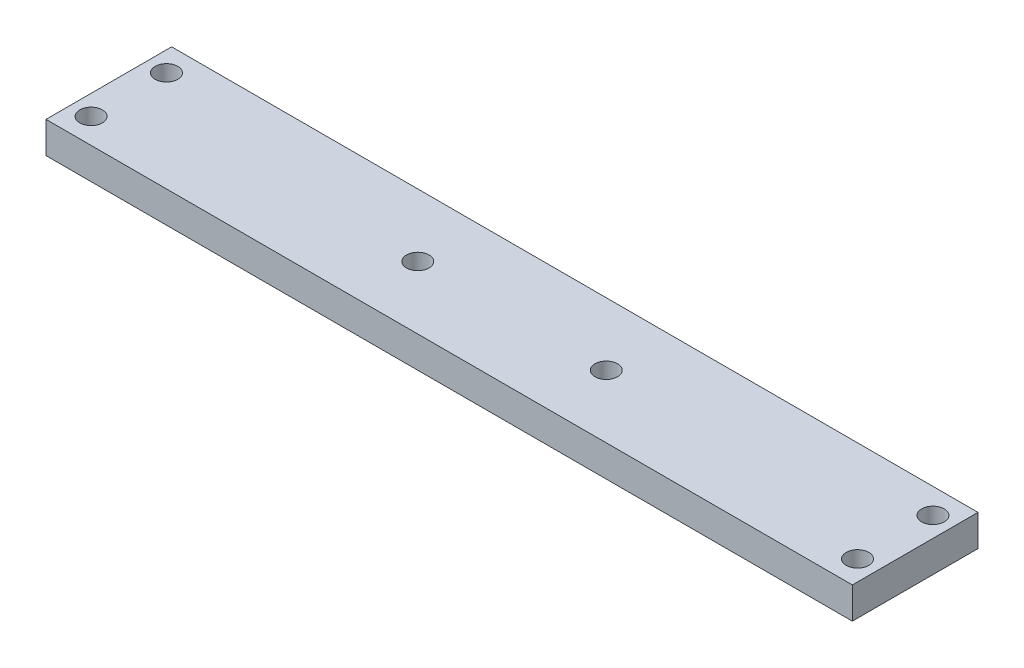
ISO-10303-21;
HEADER;
FILE_DESCRIPTION(('STEP AP214'),'2;1');
FILE_NAME('part.step','',(''),(''),'','','');
FILE_SCHEMA(('AUTOMOTIVE_DESIGN { 1 0 10303 214 1 1 1 1 }'));
ENDSEC;
DATA;
#1=APPLICATION_CONTEXT('core data for automotive mechanical design processes');
#2=APPLICATION_PROTOCOL_DEFINITION('international standard','automotive_design',2000,#1);
#3=PRODUCT_CONTEXT('',#1,'mechanical');
#4=PRODUCT('Part','Part','',(#3));
#5=PRODUCT_RELATED_PRODUCT_CATEGORY('part','',(#4));
#6=PRODUCT_DEFINITION_FORMATION('','',#4);
#7=PRODUCT_DEFINITION_CONTEXT('part definition',#1,'design');
#8=PRODUCT_DEFINITION('design','',#6,#7);
#9=PRODUCT_DEFINITION_SHAPE('','',#8);
#10=(LENGTH_UNIT() NAMED_UNIT(*) SI_UNIT(.MILLI.,.METRE.));
#11=(NAMED_UNIT(*) PLANE_ANGLE_UNIT() SI_UNIT($,.RADIAN.));
#12=(NAMED_UNIT(*) SI_UNIT($,.STERADIAN.) SOLID_ANGLE_UNIT());
#13=UNCERTAINTY_MEASURE_WITH_UNIT(LENGTH_MEASURE(1.E-05),#10,'distance_accuracy_value','');
#14=(GEOMETRIC_REPRESENTATION_CONTEXT(3) GLOBAL_UNCERTAINTY_ASSIGNED_CONTEXT((#13)) GLOBAL_UNIT_ASSIGNED_CONTEXT((#10,
#11,#12)) REPRESENTATION_CONTEXT('',''));
#15=CARTESIAN_POINT('',(0.,0.,0.));
#16=DIRECTION('',(0.,0.,1.));
#17=DIRECTION('',(1.,0.,0.));
#18=AXIS2_PLACEMENT_3D('',#15,#16,#17);
#19=CARTESIAN_POINT('',(-39.8373983739837,5.,-20.9756097560976));
#20=DIRECTION('',(1.,0.,0.));
#21=DIRECTION('',(0.,0.,-1.));
#22=AXIS2_PLACEMENT_3D('',#19,#20,#21);
#23=PLANE('',#22);
#24=DIRECTION('',(0.,0.,1.));
#25=VECTOR('',#24,1.);
#26=CARTESIAN_POINT('',(-39.8373983739837,0.,-20.9756097560976));
#27=LINE('',#26,#25);
#28=CARTESIAN_POINT('',(-39.8373983739837,0.,-20.9756097560976));
#29=VERTEX_POINT('',#28);
#30=CARTESIAN_POINT('',(-39.8373983739837,0.,-0.975609756097563));
#31=VERTEX_POINT('',#30);
#32=EDGE_CURVE('E102',#29,#31,#27,.T.);
#33=ORIENTED_EDGE('',*,*,#32,.T.);
#34=DIRECTION('',(0.,-1.,0.));
#35=VECTOR('',#34,1.);
#36=CARTESIAN_POINT('',(-39.8373983739837,5.,-0.975609756097563));
#37=LINE('',#36,#35);
#38=CARTESIAN_POINT('',(-39.8373983739837,5.,-0.975609756097563));
#39=VERTEX_POINT('',#38);
#40=EDGE_CURVE('E11',#39,#31,#37,.T.);
#41=ORIENTED_EDGE('',*,*,#40,.F.);
#42=DIRECTION('',(0.,0.,1.));
#43=VECTOR('',#42,1.);
#44=CARTESIAN_POINT('',(-39.8373983739837,5.,-20.9756097560976));
#45=LINE('',#44,#43);
#46=CARTESIAN_POINT('',(-39.8373983739837,5.,-20.9756097560976));
#47=VERTEX_POINT('',#46);
#48=EDGE_CURVE('E90',#47,#39,#45,.T.);
#49=ORIENTED_EDGE('',*,*,#48,.F.);
#50=DIRECTION('',(0.,-1.,0.));
#51=VECTOR('',#50,1.);
#52=CARTESIAN_POINT('',(-39.8373983739837,5.,-20.9756097560976));
#53=LINE('',#52,#51);
#54=EDGE_CURVE('E98',#47,#29,#53,.T.);
#55=ORIENTED_EDGE('',*,*,#54,.T.);
#56=EDGE_LOOP('',(#33,#41,#49,#55));
#57=FACE_BOUND('',#56,.T.);
#58=ADVANCED_FACE('F39',(#57),#23,.F.);
#59=CARTESIAN_POINT('',(-39.8373983739837,5.,-0.975609756097563));
#60=DIRECTION('',(0.,0.,-1.));
#61=DIRECTION('',(-1.,0.,0.));
#62=AXIS2_PLACEMENT_3D('',#59,#60,#61);
#63=PLANE('',#62);
#64=DIRECTION('',(1.,0.,0.));
#65=VECTOR('',#64,1.);
#66=CARTESIAN_POINT('',(-39.8373983739837,0.,-0.975609756097563));
#67=LINE('',#66,#65);
#68=CARTESIAN_POINT('',(88.5126016260162,0.,-0.975609756097563));
#69=VERTEX_POINT('',#68);
#70=EDGE_CURVE('E94',#31,#69,#67,.T.);
#71=ORIENTED_EDGE('',*,*,#70,.T.);
#72=DIRECTION('',(0.,-1.,0.));
#73=VECTOR('',#72,1.);
#74=CARTESIAN_POINT('',(88.5126016260162,5.,-0.975609756097563));
#75=LINE('',#74,#73);
#76=CARTESIAN_POINT('',(88.5126016260162,5.,-0.975609756097563));
#77=VERTEX_POINT('',#76);
#78=EDGE_CURVE('E47',#77,#69,#75,.T.);
#79=ORIENTED_EDGE('',*,*,#78,.F.);
#80=DIRECTION('',(1.,0.,0.));
#81=VECTOR('',#80,1.);
#82=CARTESIAN_POINT('',(-39.8373983739837,5.,-0.975609756097563));
#83=LINE('',#82,#81);
#84=EDGE_CURVE('E85',#39,#77,#83,.T.);
#85=ORIENTED_EDGE('',*,*,#84,.F.);
#86=ORIENTED_EDGE('',*,*,#40,.T.);
#87=EDGE_LOOP('',(#71,#79,#85,#86));
#88=FACE_BOUND('',#87,.T.);
#89=ADVANCED_FACE('F93',(#88),#63,.F.);
#90=CARTESIAN_POINT('',(88.5126016260162,5.,-20.9756097560976));
#91=DIRECTION('',(-1.,0.,0.));
#92=DIRECTION('',(0.,0.,1.));
#93=AXIS2_PLACEMENT_3D('',#90,#91,#92);
#94=PLANE('',#93);
#95=DIRECTION('',(0.,0.,-1.));
#96=VECTOR('',#95,1.);
#97=CARTESIAN_POINT('',(88.5126016260162,0.,-20.9756097560976));
#98=LINE('',#97,#96);
#99=CARTESIAN_POINT('',(88.5126016260162,0.,-20.9756097560976));
#100=VERTEX_POINT('',#99);
#101=EDGE_CURVE('E72',#69,#100,#98,.T.);
#102=ORIENTED_EDGE('',*,*,#101,.T.);
#103=DIRECTION('',(0.,-1.,0.));
#104=VECTOR('',#103,1.);
#105=CARTESIAN_POINT('',(88.5126016260162,5.,-20.9756097560976));
#106=LINE('',#105,#104);
#107=CARTESIAN_POINT('',(88.5126016260162,5.,-20.9756097560976));
#108=VERTEX_POINT('',#107);
#109=EDGE_CURVE('E95',#108,#100,#106,.T.);
#110=ORIENTED_EDGE('',*,*,#109,.F.);
#111=DIRECTION('',(0.,0.,-1.));
#112=VECTOR('',#111,1.);
#113=CARTESIAN_POINT('',(88.5126016260162,5.,-20.9756097560976));
#114=LINE('',#113,#112);
#115=EDGE_CURVE('E88',#77,#108,#114,.T.);
#116=ORIENTED_EDGE('',*,*,#115,.F.);
#117=ORIENTED_EDGE('',*,*,#78,.T.);
#118=EDGE_LOOP('',(#102,#110,#116,#117));
#119=FACE_BOUND('',#118,.T.);
#120=ADVANCED_FACE('F96',(#119),#94,.F.);
#121=CARTESIAN_POINT('',(-39.8373983739837,5.,-20.9756097560976));
#122=DIRECTION('',(0.,0.,1.));
#123=DIRECTION('',(1.,0.,0.));
#124=AXIS2_PLACEMENT_3D('',#121,#122,#123);
#125=PLANE('',#124);
#126=DIRECTION('',(-1.,0.,0.));
#127=VECTOR('',#126,1.);
#128=CARTESIAN_POINT('',(-39.8373983739837,0.,-20.9756097560976));
#129=LINE('',#128,#127);
#130=EDGE_CURVE('E78',#100,#29,#129,.T.);
#131=ORIENTED_EDGE('',*,*,#130,.T.);
#132=ORIENTED_EDGE('',*,*,#54,.F.);
#133=DIRECTION('',(-1.,0.,0.));
#134=VECTOR('',#133,1.);
#135=CARTESIAN_POINT('',(-39.8373983739837,5.,-20.9756097560976));
#136=LINE('',#135,#134);
#137=EDGE_CURVE('E55',#108,#47,#136,.T.);
#138=ORIENTED_EDGE('',*,*,#137,.F.);
#139=ORIENTED_EDGE('',*,*,#109,.T.);
#140=EDGE_LOOP('',(#131,#132,#138,#139));
#141=FACE_BOUND('',#140,.T.);
#142=ADVANCED_FACE('F110',(#141),#125,.F.);
#143=CARTESIAN_POINT('',(0.,5.,0.));
#144=DIRECTION('',(0.,1.,0.));
#145=DIRECTION('',(0.,0.,1.));
#146=AXIS2_PLACEMENT_3D('',#143,#144,#145);
#147=PLANE('',#146);
#148=CARTESIAN_POINT('',(9.33760162601625,5.,-10.9756097560976));
#149=DIRECTION('',(0.,1.,0.));
#150=DIRECTION('',(0.,0.,1.));
#151=AXIS2_PLACEMENT_3D('',#148,#149,#150);
#152=CIRCLE('',#151,1.79999999999999);
#153=CARTESIAN_POINT('',(9.33760162601625,5.,-9.17560975609758));
#154=VERTEX_POINT('',#153);
#155=EDGE_CURVE('E148',#154,#154,#152,.T.);
#156=ORIENTED_EDGE('',*,*,#155,.F.);
#157=EDGE_LOOP('',(#156));
#158=FACE_BOUND('',#157,.T.);
#159=CARTESIAN_POINT('',(39.3376016260163,5.,-10.9756097560976));
#160=DIRECTION('',(0.,1.,0.));
#161=DIRECTION('',(0.,0.,1.));
#162=AXIS2_PLACEMENT_3D('',#159,#160,#161);
#163=CIRCLE('',#162,1.79999999999999);
#164=CARTESIAN_POINT('',(39.3376016260163,5.,-9.17560975609759));
#165=VERTEX_POINT('',#164);
#166=EDGE_CURVE('E142',#165,#165,#163,.T.);
#167=ORIENTED_EDGE('',*,*,#166,.F.);
#168=EDGE_LOOP('',(#167));
#169=FACE_BOUND('',#168,.T.);
#170=CARTESIAN_POINT('',(-36.6623983739837,5.,-16.9756097560976));
#171=DIRECTION('',(0.,1.,0.));
#172=DIRECTION('',(0.,0.,1.));
#173=AXIS2_PLACEMENT_3D('',#170,#171,#172);
#174=CIRCLE('',#173,1.8);
#175=CARTESIAN_POINT('',(-36.6623983739837,5.,-15.1756097560976));
#176=VERTEX_POINT('',#175);
#177=EDGE_CURVE('E136',#176,#176,#174,.T.);
#178=ORIENTED_EDGE('',*,*,#177,.F.);
#179=EDGE_LOOP('',(#178));
#180=FACE_BOUND('',#179,.T.);
#181=CARTESIAN_POINT('',(-36.6623983739837,5.,-4.97560975609756));
#182=DIRECTION('',(0.,1.,0.));
#183=DIRECTION('',(0.,0.,1.));
#184=AXIS2_PLACEMENT_3D('',#181,#182,#183);
#185=CIRCLE('',#184,1.8);
#186=CARTESIAN_POINT('',(-36.6623983739837,5.,-3.17560975609757));
#187=VERTEX_POINT('',#186);
#188=EDGE_CURVE('E130',#187,#187,#185,.T.);
#189=ORIENTED_EDGE('',*,*,#188,.F.);
#190=EDGE_LOOP('',(#189));
#191=FACE_BOUND('',#190,.T.);
#192=CARTESIAN_POINT('',(85.3376016260163,5.,-16.9756097560976));
#193=DIRECTION('',(0.,1.,0.));
#194=DIRECTION('',(0.,0.,1.));
#195=AXIS2_PLACEMENT_3D('',#192,#193,#194);
#196=CIRCLE('',#195,1.8);
#197=CARTESIAN_POINT('',(85.3376016260163,5.,-15.1756097560976));
#198=VERTEX_POINT('',#197);
#199=EDGE_CURVE('E124',#198,#198,#196,.T.);
#200=ORIENTED_EDGE('',*,*,#199,.F.);
#201=EDGE_LOOP('',(#200));
#202=FACE_BOUND('',#201,.T.);
#203=CARTESIAN_POINT('',(85.3376016260162,5.,-4.97560975609756));
#204=DIRECTION('',(0.,1.,0.));
#205=DIRECTION('',(0.,0.,1.));
#206=AXIS2_PLACEMENT_3D('',#203,#204,#205);
#207=CIRCLE('',#206,1.8);
#208=CARTESIAN_POINT('',(85.3376016260162,5.,-3.17560975609757));
#209=VERTEX_POINT('',#208);
#210=EDGE_CURVE('E118',#209,#209,#207,.T.);
#211=ORIENTED_EDGE('',*,*,#210,.F.);
#212=EDGE_LOOP('',(#211));
#213=FACE_BOUND('',#212,.T.);
#214=ORIENTED_EDGE('',*,*,#48,.T.);
#215=ORIENTED_EDGE('',*,*,#84,.T.);
#216=ORIENTED_EDGE('',*,*,#115,.T.);
#217=ORIENTED_EDGE('',*,*,#137,.T.);
#218=EDGE_LOOP('',(#214,#215,#216,#217));
#219=FACE_BOUND('',#218,.T.);
#220=ADVANCED_FACE('F86',(#158,#169,#180,#191,#202,#213,#219),#147,.T.);
#221=CARTESIAN_POINT('',(0.,0.,0.));
#222=DIRECTION('',(0.,1.,0.));
#223=DIRECTION('',(0.,0.,1.));
#224=AXIS2_PLACEMENT_3D('',#221,#222,#223);
#225=PLANE('',#224);
#226=CARTESIAN_POINT('',(9.33760162601625,0.,-10.9756097560976));
#227=DIRECTION('',(0.,1.,0.));
#228=DIRECTION('',(0.,0.,1.));
#229=AXIS2_PLACEMENT_3D('',#226,#227,#228);
#230=CIRCLE('',#229,1.79999999999999);
#231=CARTESIAN_POINT('',(9.33760162601625,0.,-9.17560975609758));
#232=VERTEX_POINT('',#231);
#233=EDGE_CURVE('E145',#232,#232,#230,.T.);
#234=ORIENTED_EDGE('',*,*,#233,.T.);
#235=EDGE_LOOP('',(#234));
#236=FACE_BOUND('',#235,.T.);
#237=CARTESIAN_POINT('',(39.3376016260163,0.,-10.9756097560976));
#238=DIRECTION('',(0.,1.,0.));
#239=DIRECTION('',(0.,0.,1.));
#240=AXIS2_PLACEMENT_3D('',#237,#238,#239);
#241=CIRCLE('',#240,1.79999999999999);
#242=CARTESIAN_POINT('',(39.3376016260163,0.,-9.17560975609759));
#243=VERTEX_POINT('',#242);
#244=EDGE_CURVE('E139',#243,#243,#241,.T.);
#245=ORIENTED_EDGE('',*,*,#244,.T.);
#246=EDGE_LOOP('',(#245));
#247=FACE_BOUND('',#246,.T.);
#248=CARTESIAN_POINT('',(-36.6623983739837,0.,-16.9756097560976));
#249=DIRECTION('',(0.,1.,0.));
#250=DIRECTION('',(0.,0.,1.));
#251=AXIS2_PLACEMENT_3D('',#248,#249,#250);
#252=CIRCLE('',#251,1.8);
#253=CARTESIAN_POINT('',(-36.6623983739837,0.,-15.1756097560976));
#254=VERTEX_POINT('',#253);
#255=EDGE_CURVE('E133',#254,#254,#252,.T.);
#256=ORIENTED_EDGE('',*,*,#255,.T.);
#257=EDGE_LOOP('',(#256));
#258=FACE_BOUND('',#257,.T.);
#259=CARTESIAN_POINT('',(-36.6623983739837,0.,-4.97560975609756));
#260=DIRECTION('',(0.,1.,0.));
#261=DIRECTION('',(0.,0.,1.));
#262=AXIS2_PLACEMENT_3D('',#259,#260,#261);
#263=CIRCLE('',#262,1.8);
#264=CARTESIAN_POINT('',(-36.6623983739837,0.,-3.17560975609757));
#265=VERTEX_POINT('',#264);
#266=EDGE_CURVE('E127',#265,#265,#263,.T.);
#267=ORIENTED_EDGE('',*,*,#266,.T.);
#268=EDGE_LOOP('',(#267));
#269=FACE_BOUND('',#268,.T.);
#270=CARTESIAN_POINT('',(85.3376016260163,0.,-16.9756097560976));
#271=DIRECTION('',(0.,1.,0.));
#272=DIRECTION('',(0.,0.,1.));
#273=AXIS2_PLACEMENT_3D('',#270,#271,#272);
#274=CIRCLE('',#273,1.8);
#275=CARTESIAN_POINT('',(85.3376016260163,0.,-15.1756097560976));
#276=VERTEX_POINT('',#275);
#277=EDGE_CURVE('E121',#276,#276,#274,.T.);
#278=ORIENTED_EDGE('',*,*,#277,.T.);
#279=EDGE_LOOP('',(#278));
#280=FACE_BOUND('',#279,.T.);
#281=CARTESIAN_POINT('',(85.3376016260162,0.,-4.97560975609756));
#282=DIRECTION('',(0.,1.,0.));
#283=DIRECTION('',(0.,0.,1.));
#284=AXIS2_PLACEMENT_3D('',#281,#282,#283);
#285=CIRCLE('',#284,1.8);
#286=CARTESIAN_POINT('',(85.3376016260162,0.,-3.17560975609757));
#287=VERTEX_POINT('',#286);
#288=EDGE_CURVE('E105',#287,#287,#285,.T.);
#289=ORIENTED_EDGE('',*,*,#288,.T.);
#290=EDGE_LOOP('',(#289));
#291=FACE_BOUND('',#290,.T.);
#292=ORIENTED_EDGE('',*,*,#32,.F.);
#293=ORIENTED_EDGE('',*,*,#130,.F.);
#294=ORIENTED_EDGE('',*,*,#101,.F.);
#295=ORIENTED_EDGE('',*,*,#70,.F.);
#296=EDGE_LOOP('',(#292,#293,#294,#295));
#297=FACE_BOUND('',#296,.T.);
#298=ADVANCED_FACE('F113',(#236,#247,#258,#269,#280,#291,#297),#225,.F.);
#299=CARTESIAN_POINT('',(85.3376016260162,5.,-4.97560975609756));
#300=DIRECTION('',(0.,1.,0.));
#301=DIRECTION('',(0.,0.,1.));
#302=AXIS2_PLACEMENT_3D('',#299,#300,#301);
#303=CYLINDRICAL_SURFACE('',#302,1.8);
#304=ORIENTED_EDGE('',*,*,#288,.F.);
#305=EDGE_LOOP('',(#304));
#306=FACE_BOUND('',#305,.T.);
#307=ORIENTED_EDGE('',*,*,#210,.T.);
#308=EDGE_LOOP('',(#307));
#309=FACE_BOUND('',#308,.T.);
#310=ADVANCED_FACE('F167',(#306,#309),#303,.F.);
#311=CARTESIAN_POINT('',(85.3376016260163,5.,-16.9756097560976));
#312=DIRECTION('',(0.,1.,0.));
#313=DIRECTION('',(0.,0.,1.));
#314=AXIS2_PLACEMENT_3D('',#311,#312,#313);
#315=CYLINDRICAL_SURFACE('',#314,1.8);
#316=ORIENTED_EDGE('',*,*,#277,.F.);
#317=EDGE_LOOP('',(#316));
#318=FACE_BOUND('',#317,.T.);
#319=ORIENTED_EDGE('',*,*,#199,.T.);
#320=EDGE_LOOP('',(#319));
#321=FACE_BOUND('',#320,.T.);
#322=ADVANCED_FACE('F169',(#318,#321),#315,.F.);
#323=CARTESIAN_POINT('',(-36.6623983739837,5.,-4.97560975609756));
#324=DIRECTION('',(0.,1.,0.));
#325=DIRECTION('',(0.,0.,1.));
#326=AXIS2_PLACEMENT_3D('',#323,#324,#325);
#327=CYLINDRICAL_SURFACE('',#326,1.8);
#328=ORIENTED_EDGE('',*,*,#266,.F.);
#329=EDGE_LOOP('',(#328));
#330=FACE_BOUND('',#329,.T.);
#331=ORIENTED_EDGE('',*,*,#188,.T.);
#332=EDGE_LOOP('',(#331));
#333=FACE_BOUND('',#332,.T.);
#334=ADVANCED_FACE('F176',(#330,#333),#327,.F.);
#335=CARTESIAN_POINT('',(-36.6623983739837,5.,-16.9756097560976));
#336=DIRECTION('',(0.,1.,0.));
#337=DIRECTION('',(0.,0.,1.));
#338=AXIS2_PLACEMENT_3D('',#335,#336,#337);
#339=CYLINDRICAL_SURFACE('',#338,1.8);
#340=ORIENTED_EDGE('',*,*,#255,.F.);
#341=EDGE_LOOP('',(#340));
#342=FACE_BOUND('',#341,.T.);
#343=ORIENTED_EDGE('',*,*,#177,.T.);
#344=EDGE_LOOP('',(#343));
#345=FACE_BOUND('',#344,.T.);
#346=ADVANCED_FACE('F236',(#342,#345),#339,.F.);
#347=CARTESIAN_POINT('',(39.3376016260163,5.,-10.9756097560976));
#348=DIRECTION('',(0.,1.,0.));
#349=DIRECTION('',(0.,0.,1.));
#350=AXIS2_PLACEMENT_3D('',#347,#348,#349);
#351=CYLINDRICAL_SURFACE('',#350,1.79999999999999);
#352=ORIENTED_EDGE('',*,*,#244,.F.);
#353=EDGE_LOOP('',(#352));
#354=FACE_BOUND('',#353,.T.);
#355=ORIENTED_EDGE('',*,*,#166,.T.);
#356=EDGE_LOOP('',(#355));
#357=FACE_BOUND('',#356,.T.);
#358=ADVANCED_FACE('F245',(#354,#357),#351,.F.);
#359=CARTESIAN_POINT('',(9.33760162601625,5.,-10.9756097560976));
#360=DIRECTION('',(0.,1.,0.));
#361=DIRECTION('',(0.,0.,1.));
#362=AXIS2_PLACEMENT_3D('',#359,#360,#361);
#363=CYLINDRICAL_SURFACE('',#362,1.79999999999999);
#364=ORIENTED_EDGE('',*,*,#233,.F.);
#365=EDGE_LOOP('',(#364));
#366=FACE_BOUND('',#365,.T.);
#367=ORIENTED_EDGE('',*,*,#155,.T.);
#368=EDGE_LOOP('',(#367));
#369=FACE_BOUND('',#368,.T.);
#370=ADVANCED_FACE('F152',(#366,#369),#363,.F.);
#371=CLOSED_SHELL('',(#58,#89,#120,#142,#220,#298,#310,#322,#334,#346,#358,#370));
#372=MANIFOLD_SOLID_BREP('B2',#371);
#373=ADVANCED_BREP_SHAPE_REPRESENTATION('',(#18,#372),#14);
#374=SHAPE_DEFINITION_REPRESENTATION(#9,#373);
ENDSEC;
END-ISO-10303-21;
